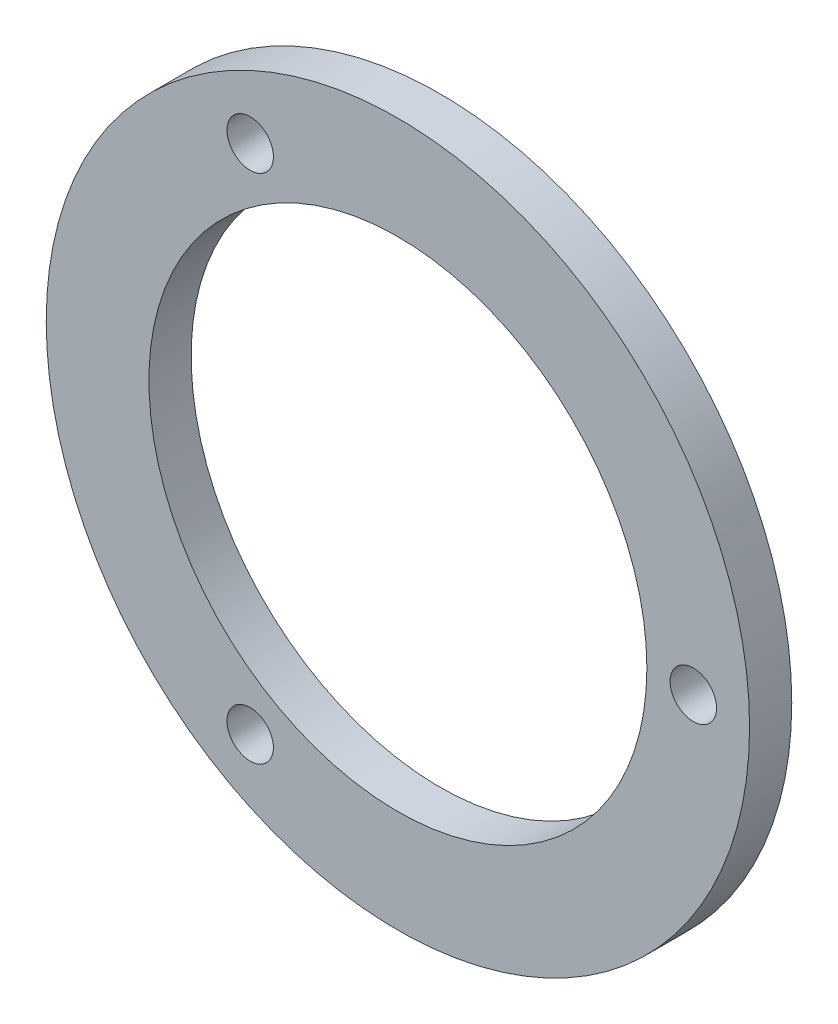
ISO-10303-21;
HEADER;
FILE_DESCRIPTION(('STEP AP214'),'2;1');
FILE_NAME('part.step','',(''),(''),'','','');
FILE_SCHEMA(('AUTOMOTIVE_DESIGN { 1 0 10303 214 1 1 1 1 }'));
ENDSEC;
DATA;
#1=APPLICATION_CONTEXT('core data for automotive mechanical design processes');
#2=APPLICATION_PROTOCOL_DEFINITION('international standard','automotive_design',2000,#1);
#3=PRODUCT_CONTEXT('',#1,'mechanical');
#4=PRODUCT('Part','Part','',(#3));
#5=PRODUCT_RELATED_PRODUCT_CATEGORY('part','',(#4));
#6=PRODUCT_DEFINITION_FORMATION('','',#4);
#7=PRODUCT_DEFINITION_CONTEXT('part definition',#1,'design');
#8=PRODUCT_DEFINITION('design','',#6,#7);
#9=PRODUCT_DEFINITION_SHAPE('','',#8);
#10=(LENGTH_UNIT() NAMED_UNIT(*) SI_UNIT(.MILLI.,.METRE.));
#11=(NAMED_UNIT(*) PLANE_ANGLE_UNIT() SI_UNIT($,.RADIAN.));
#12=(NAMED_UNIT(*) SI_UNIT($,.STERADIAN.) SOLID_ANGLE_UNIT());
#13=UNCERTAINTY_MEASURE_WITH_UNIT(LENGTH_MEASURE(1.E-05),#10,'distance_accuracy_value','');
#14=(GEOMETRIC_REPRESENTATION_CONTEXT(3) GLOBAL_UNCERTAINTY_ASSIGNED_CONTEXT((#13)) GLOBAL_UNIT_ASSIGNED_CONTEXT((#10,
#11,#12)) REPRESENTATION_CONTEXT('',''));
#15=CARTESIAN_POINT('',(0.,0.,0.));
#16=DIRECTION('',(0.,0.,1.));
#17=DIRECTION('',(1.,0.,0.));
#18=AXIS2_PLACEMENT_3D('',#15,#16,#17);
#19=CARTESIAN_POINT('',(21.,0.,3.));
#20=DIRECTION('',(0.,0.,-1.));
#21=DIRECTION('',(-1.,0.,0.));
#22=AXIS2_PLACEMENT_3D('',#19,#20,#21);
#23=CYLINDRICAL_SURFACE('',#22,1.65);
#24=CARTESIAN_POINT('',(21.,0.,3.));
#25=DIRECTION('',(0.,0.,1.));
#26=DIRECTION('',(1.,0.,0.));
#27=AXIS2_PLACEMENT_3D('',#24,#25,#26);
#28=CIRCLE('',#27,1.65);
#29=CARTESIAN_POINT('',(22.65,0.,3.));
#30=VERTEX_POINT('',#29);
#31=EDGE_CURVE('E43',#30,#30,#28,.T.);
#32=ORIENTED_EDGE('',*,*,#31,.T.);
#33=EDGE_LOOP('',(#32));
#34=FACE_BOUND('',#33,.T.);
#35=CARTESIAN_POINT('',(21.,0.,0.));
#36=DIRECTION('',(0.,0.,1.));
#37=DIRECTION('',(1.,0.,0.));
#38=AXIS2_PLACEMENT_3D('',#35,#36,#37);
#39=CIRCLE('',#38,1.65);
#40=CARTESIAN_POINT('',(22.65,0.,0.));
#41=VERTEX_POINT('',#40);
#42=EDGE_CURVE('E60',#41,#41,#39,.T.);
#43=ORIENTED_EDGE('',*,*,#42,.F.);
#44=EDGE_LOOP('',(#43));
#45=FACE_BOUND('',#44,.T.);
#46=ADVANCED_FACE('F35',(#34,#45),#23,.F.);
#47=CARTESIAN_POINT('',(0.,0.,3.));
#48=DIRECTION('',(0.,0.,-1.));
#49=DIRECTION('',(-1.,0.,0.));
#50=AXIS2_PLACEMENT_3D('',#47,#48,#49);
#51=CYLINDRICAL_SURFACE('',#50,17.7);
#52=CARTESIAN_POINT('',(0.,0.,3.));
#53=DIRECTION('',(0.,0.,1.));
#54=DIRECTION('',(1.,0.,0.));
#55=AXIS2_PLACEMENT_3D('',#52,#53,#54);
#56=CIRCLE('',#55,17.7);
#57=CARTESIAN_POINT('',(17.7,0.,3.));
#58=VERTEX_POINT('',#57);
#59=EDGE_CURVE('E48',#58,#58,#56,.T.);
#60=ORIENTED_EDGE('',*,*,#59,.T.);
#61=EDGE_LOOP('',(#60));
#62=FACE_BOUND('',#61,.T.);
#63=CARTESIAN_POINT('',(0.,0.,0.));
#64=DIRECTION('',(0.,0.,1.));
#65=DIRECTION('',(1.,0.,0.));
#66=AXIS2_PLACEMENT_3D('',#63,#64,#65);
#67=CIRCLE('',#66,17.7);
#68=CARTESIAN_POINT('',(17.7,0.,0.));
#69=VERTEX_POINT('',#68);
#70=EDGE_CURVE('E58',#69,#69,#67,.T.);
#71=ORIENTED_EDGE('',*,*,#70,.F.);
#72=EDGE_LOOP('',(#71));
#73=FACE_BOUND('',#72,.T.);
#74=ADVANCED_FACE('F78',(#62,#73),#51,.F.);
#75=CARTESIAN_POINT('',(-10.5000000000001,18.1865334794732,3.));
#76=DIRECTION('',(0.,0.,-1.));
#77=DIRECTION('',(-1.,0.,0.));
#78=AXIS2_PLACEMENT_3D('',#75,#76,#77);
#79=CYLINDRICAL_SURFACE('',#78,1.65);
#80=CARTESIAN_POINT('',(-10.5000000000001,18.1865334794732,3.));
#81=DIRECTION('',(0.,0.,1.));
#82=DIRECTION('',(1.,0.,0.));
#83=AXIS2_PLACEMENT_3D('',#80,#81,#82);
#84=CIRCLE('',#83,1.65);
#85=CARTESIAN_POINT('',(-8.85000000000009,18.1865334794732,3.));
#86=VERTEX_POINT('',#85);
#87=EDGE_CURVE('E69',#86,#86,#84,.T.);
#88=ORIENTED_EDGE('',*,*,#87,.T.);
#89=EDGE_LOOP('',(#88));
#90=FACE_BOUND('',#89,.T.);
#91=CARTESIAN_POINT('',(-10.5000000000001,18.1865334794732,0.));
#92=DIRECTION('',(0.,0.,1.));
#93=DIRECTION('',(1.,0.,0.));
#94=AXIS2_PLACEMENT_3D('',#91,#92,#93);
#95=CIRCLE('',#94,1.65);
#96=CARTESIAN_POINT('',(-8.85000000000009,18.1865334794732,0.));
#97=VERTEX_POINT('',#96);
#98=EDGE_CURVE('E55',#97,#97,#95,.T.);
#99=ORIENTED_EDGE('',*,*,#98,.F.);
#100=EDGE_LOOP('',(#99));
#101=FACE_BOUND('',#100,.T.);
#102=ADVANCED_FACE('F96',(#90,#101),#79,.F.);
#103=CARTESIAN_POINT('',(-10.5000000000001,-18.1865334794732,3.));
#104=DIRECTION('',(0.,0.,-1.));
#105=DIRECTION('',(-1.,0.,0.));
#106=AXIS2_PLACEMENT_3D('',#103,#104,#105);
#107=CYLINDRICAL_SURFACE('',#106,1.65);
#108=CARTESIAN_POINT('',(-10.5000000000001,-18.1865334794732,3.));
#109=DIRECTION('',(0.,0.,1.));
#110=DIRECTION('',(1.,0.,0.));
#111=AXIS2_PLACEMENT_3D('',#108,#109,#110);
#112=CIRCLE('',#111,1.65);
#113=CARTESIAN_POINT('',(-8.85000000000008,-18.1865334794732,3.));
#114=VERTEX_POINT('',#113);
#115=EDGE_CURVE('E65',#114,#114,#112,.T.);
#116=ORIENTED_EDGE('',*,*,#115,.T.);
#117=EDGE_LOOP('',(#116));
#118=FACE_BOUND('',#117,.T.);
#119=CARTESIAN_POINT('',(-10.5000000000001,-18.1865334794732,0.));
#120=DIRECTION('',(0.,0.,1.));
#121=DIRECTION('',(1.,0.,0.));
#122=AXIS2_PLACEMENT_3D('',#119,#120,#121);
#123=CIRCLE('',#122,1.65);
#124=CARTESIAN_POINT('',(-8.85000000000008,-18.1865334794732,0.));
#125=VERTEX_POINT('',#124);
#126=EDGE_CURVE('E52',#125,#125,#123,.T.);
#127=ORIENTED_EDGE('',*,*,#126,.F.);
#128=EDGE_LOOP('',(#127));
#129=FACE_BOUND('',#128,.T.);
#130=ADVANCED_FACE('F37',(#118,#129),#107,.F.);
#131=CARTESIAN_POINT('',(0.,0.,3.));
#132=DIRECTION('',(0.,0.,-1.));
#133=DIRECTION('',(-1.,0.,0.));
#134=AXIS2_PLACEMENT_3D('',#131,#132,#133);
#135=CYLINDRICAL_SURFACE('',#134,25.);
#136=CARTESIAN_POINT('',(0.,0.,3.));
#137=DIRECTION('',(0.,0.,1.));
#138=DIRECTION('',(1.,0.,0.));
#139=AXIS2_PLACEMENT_3D('',#136,#137,#138);
#140=CIRCLE('',#139,25.);
#141=CARTESIAN_POINT('',(25.,0.,3.));
#142=VERTEX_POINT('',#141);
#143=EDGE_CURVE('E10',#142,#142,#140,.T.);
#144=ORIENTED_EDGE('',*,*,#143,.F.);
#145=EDGE_LOOP('',(#144));
#146=FACE_BOUND('',#145,.T.);
#147=CARTESIAN_POINT('',(0.,0.,0.));
#148=DIRECTION('',(0.,0.,1.));
#149=DIRECTION('',(1.,0.,0.));
#150=AXIS2_PLACEMENT_3D('',#147,#148,#149);
#151=CIRCLE('',#150,25.);
#152=CARTESIAN_POINT('',(25.,0.,0.));
#153=VERTEX_POINT('',#152);
#154=EDGE_CURVE('E39',#153,#153,#151,.T.);
#155=ORIENTED_EDGE('',*,*,#154,.T.);
#156=EDGE_LOOP('',(#155));
#157=FACE_BOUND('',#156,.T.);
#158=ADVANCED_FACE('F85',(#146,#157),#135,.T.);
#159=CARTESIAN_POINT('',(0.,0.,3.));
#160=DIRECTION('',(0.,0.,1.));
#161=DIRECTION('',(1.,0.,0.));
#162=AXIS2_PLACEMENT_3D('',#159,#160,#161);
#163=PLANE('',#162);
#164=ORIENTED_EDGE('',*,*,#115,.F.);
#165=EDGE_LOOP('',(#164));
#166=FACE_BOUND('',#165,.T.);
#167=ORIENTED_EDGE('',*,*,#87,.F.);
#168=EDGE_LOOP('',(#167));
#169=FACE_BOUND('',#168,.T.);
#170=ORIENTED_EDGE('',*,*,#59,.F.);
#171=EDGE_LOOP('',(#170));
#172=FACE_BOUND('',#171,.T.);
#173=ORIENTED_EDGE('',*,*,#31,.F.);
#174=EDGE_LOOP('',(#173));
#175=FACE_BOUND('',#174,.T.);
#176=ORIENTED_EDGE('',*,*,#143,.T.);
#177=EDGE_LOOP('',(#176));
#178=FACE_BOUND('',#177,.T.);
#179=ADVANCED_FACE('F81',(#166,#169,#172,#175,#178),#163,.T.);
#180=CARTESIAN_POINT('',(0.,0.,0.));
#181=DIRECTION('',(0.,0.,1.));
#182=DIRECTION('',(1.,0.,0.));
#183=AXIS2_PLACEMENT_3D('',#180,#181,#182);
#184=PLANE('',#183);
#185=ORIENTED_EDGE('',*,*,#126,.T.);
#186=EDGE_LOOP('',(#185));
#187=FACE_BOUND('',#186,.T.);
#188=ORIENTED_EDGE('',*,*,#98,.T.);
#189=EDGE_LOOP('',(#188));
#190=FACE_BOUND('',#189,.T.);
#191=ORIENTED_EDGE('',*,*,#70,.T.);
#192=EDGE_LOOP('',(#191));
#193=FACE_BOUND('',#192,.T.);
#194=ORIENTED_EDGE('',*,*,#42,.T.);
#195=EDGE_LOOP('',(#194));
#196=FACE_BOUND('',#195,.T.);
#197=ORIENTED_EDGE('',*,*,#154,.F.);
#198=EDGE_LOOP('',(#197));
#199=FACE_BOUND('',#198,.T.);
#200=ADVANCED_FACE('F84',(#187,#190,#193,#196,#199),#184,.F.);
#201=CLOSED_SHELL('',(#46,#74,#102,#130,#158,#179,#200));
#202=MANIFOLD_SOLID_BREP('B2',#201);
#203=ADVANCED_BREP_SHAPE_REPRESENTATION('',(#18,#202),#14);
#204=SHAPE_DEFINITION_REPRESENTATION(#9,#203);
ENDSEC;
END-ISO-10303-21;
